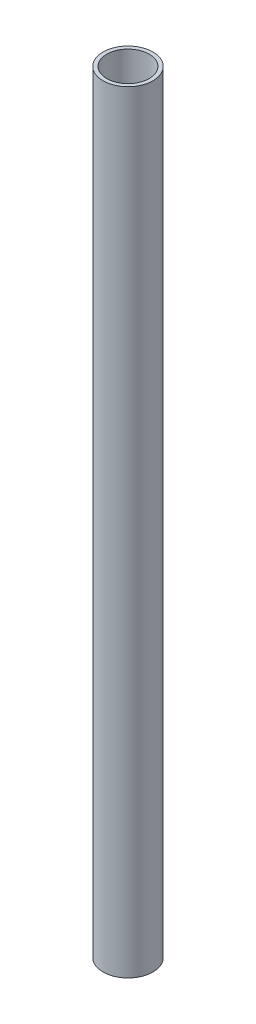
ISO-10303-21;
HEADER;
FILE_DESCRIPTION(('STEP AP214'),'2;1');
FILE_NAME('part.step','',(''),(''),'','','');
FILE_SCHEMA(('AUTOMOTIVE_DESIGN { 1 0 10303 214 1 1 1 1 }'));
ENDSEC;
DATA;
#1=APPLICATION_CONTEXT('core data for automotive mechanical design processes');
#2=APPLICATION_PROTOCOL_DEFINITION('international standard','automotive_design',2000,#1);
#3=PRODUCT_CONTEXT('',#1,'mechanical');
#4=PRODUCT('Part','Part','',(#3));
#5=PRODUCT_RELATED_PRODUCT_CATEGORY('part','',(#4));
#6=PRODUCT_DEFINITION_FORMATION('','',#4);
#7=PRODUCT_DEFINITION_CONTEXT('part definition',#1,'design');
#8=PRODUCT_DEFINITION('design','',#6,#7);
#9=PRODUCT_DEFINITION_SHAPE('','',#8);
#10=(LENGTH_UNIT() NAMED_UNIT(*) SI_UNIT(.MILLI.,.METRE.));
#11=(NAMED_UNIT(*) PLANE_ANGLE_UNIT() SI_UNIT($,.RADIAN.));
#12=(NAMED_UNIT(*) SI_UNIT($,.STERADIAN.) SOLID_ANGLE_UNIT());
#13=UNCERTAINTY_MEASURE_WITH_UNIT(LENGTH_MEASURE(1.E-05),#10,'distance_accuracy_value','');
#14=(GEOMETRIC_REPRESENTATION_CONTEXT(3) GLOBAL_UNCERTAINTY_ASSIGNED_CONTEXT((#13)) GLOBAL_UNIT_ASSIGNED_CONTEXT((#10,
#11,#12)) REPRESENTATION_CONTEXT('',''));
#15=CARTESIAN_POINT('',(0.,0.,0.));
#16=DIRECTION('',(0.,0.,1.));
#17=DIRECTION('',(1.,0.,0.));
#18=AXIS2_PLACEMENT_3D('',#15,#16,#17);
#19=CARTESIAN_POINT('',(0.,619.,0.));
#20=DIRECTION('',(0.,1.,0.));
#21=DIRECTION('',(0.,0.,1.));
#22=AXIS2_PLACEMENT_3D('',#19,#20,#21);
#23=PLANE('',#22);
#24=CARTESIAN_POINT('',(0.,619.,0.));
#25=DIRECTION('',(0.,1.,0.));
#26=DIRECTION('',(0.,0.,1.));
#27=AXIS2_PLACEMENT_3D('',#24,#25,#26);
#28=CIRCLE('',#27,20.);
#29=CARTESIAN_POINT('',(0.,619.,20.));
#30=VERTEX_POINT('',#29);
#31=EDGE_CURVE('E10',#30,#30,#28,.T.);
#32=ORIENTED_EDGE('',*,*,#31,.T.);
#33=EDGE_LOOP('',(#32));
#34=FACE_BOUND('',#33,.T.);
#35=CARTESIAN_POINT('',(0.,619.,0.));
#36=DIRECTION('',(0.,1.,0.));
#37=DIRECTION('',(0.,0.,1.));
#38=AXIS2_PLACEMENT_3D('',#35,#36,#37);
#39=CIRCLE('',#38,17.);
#40=CARTESIAN_POINT('',(0.,619.,17.));
#41=VERTEX_POINT('',#40);
#42=EDGE_CURVE('E47',#41,#41,#39,.T.);
#43=ORIENTED_EDGE('',*,*,#42,.F.);
#44=EDGE_LOOP('',(#43));
#45=FACE_BOUND('',#44,.T.);
#46=ADVANCED_FACE('F36',(#34,#45),#23,.T.);
#47=CARTESIAN_POINT('',(0.,0.,0.));
#48=DIRECTION('',(0.,1.,0.));
#49=DIRECTION('',(0.,0.,1.));
#50=AXIS2_PLACEMENT_3D('',#47,#48,#49);
#51=PLANE('',#50);
#52=CARTESIAN_POINT('',(0.,0.,0.));
#53=DIRECTION('',(0.,1.,0.));
#54=DIRECTION('',(0.,0.,1.));
#55=AXIS2_PLACEMENT_3D('',#52,#53,#54);
#56=CIRCLE('',#55,20.);
#57=CARTESIAN_POINT('',(0.,0.,20.));
#58=VERTEX_POINT('',#57);
#59=EDGE_CURVE('E40',#58,#58,#56,.T.);
#60=ORIENTED_EDGE('',*,*,#59,.F.);
#61=EDGE_LOOP('',(#60));
#62=FACE_BOUND('',#61,.T.);
#63=CARTESIAN_POINT('',(0.,0.,0.));
#64=DIRECTION('',(0.,1.,0.));
#65=DIRECTION('',(0.,0.,1.));
#66=AXIS2_PLACEMENT_3D('',#63,#64,#65);
#67=CIRCLE('',#66,17.);
#68=CARTESIAN_POINT('',(0.,0.,17.));
#69=VERTEX_POINT('',#68);
#70=EDGE_CURVE('E49',#69,#69,#67,.T.);
#71=ORIENTED_EDGE('',*,*,#70,.T.);
#72=EDGE_LOOP('',(#71));
#73=FACE_BOUND('',#72,.T.);
#74=ADVANCED_FACE('F59',(#62,#73),#51,.F.);
#75=CARTESIAN_POINT('',(0.,619.,0.));
#76=DIRECTION('',(0.,-1.,0.));
#77=DIRECTION('',(0.,0.,-1.));
#78=AXIS2_PLACEMENT_3D('',#75,#76,#77);
#79=CYLINDRICAL_SURFACE('',#78,20.);
#80=ORIENTED_EDGE('',*,*,#31,.F.);
#81=EDGE_LOOP('',(#80));
#82=FACE_BOUND('',#81,.T.);
#83=ORIENTED_EDGE('',*,*,#59,.T.);
#84=EDGE_LOOP('',(#83));
#85=FACE_BOUND('',#84,.T.);
#86=ADVANCED_FACE('F38',(#82,#85),#79,.T.);
#87=CARTESIAN_POINT('',(0.,619.,0.));
#88=DIRECTION('',(0.,-1.,0.));
#89=DIRECTION('',(0.,0.,-1.));
#90=AXIS2_PLACEMENT_3D('',#87,#88,#89);
#91=CYLINDRICAL_SURFACE('',#90,17.);
#92=ORIENTED_EDGE('',*,*,#42,.T.);
#93=EDGE_LOOP('',(#92));
#94=FACE_BOUND('',#93,.T.);
#95=ORIENTED_EDGE('',*,*,#70,.F.);
#96=EDGE_LOOP('',(#95));
#97=FACE_BOUND('',#96,.T.);
#98=ADVANCED_FACE('F55',(#94,#97),#91,.F.);
#99=CLOSED_SHELL('',(#46,#74,#86,#98));
#100=MANIFOLD_SOLID_BREP('B2',#99);
#101=ADVANCED_BREP_SHAPE_REPRESENTATION('',(#18,#100),#14);
#102=SHAPE_DEFINITION_REPRESENTATION(#9,#101);
ENDSEC;
END-ISO-10303-21;
